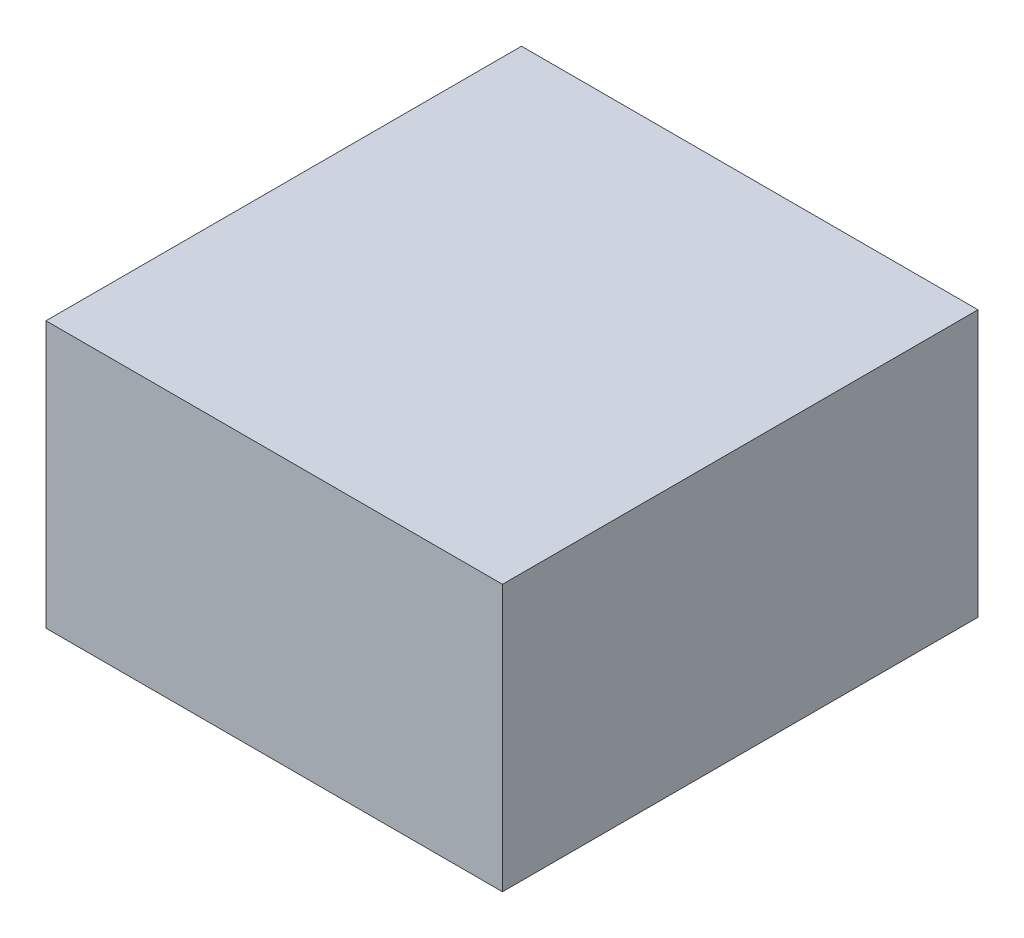
ISO-10303-21;
HEADER;
FILE_DESCRIPTION(('STEP AP214'),'2;1');
FILE_NAME('part.step','',(''),(''),'','','');
FILE_SCHEMA(('AUTOMOTIVE_DESIGN { 1 0 10303 214 1 1 1 1 }'));
ENDSEC;
DATA;
#1=APPLICATION_CONTEXT('core data for automotive mechanical design processes');
#2=APPLICATION_PROTOCOL_DEFINITION('international standard','automotive_design',2000,#1);
#3=PRODUCT_CONTEXT('',#1,'mechanical');
#4=PRODUCT('Part','Part','',(#3));
#5=PRODUCT_RELATED_PRODUCT_CATEGORY('part','',(#4));
#6=PRODUCT_DEFINITION_FORMATION('','',#4);
#7=PRODUCT_DEFINITION_CONTEXT('part definition',#1,'design');
#8=PRODUCT_DEFINITION('design','',#6,#7);
#9=PRODUCT_DEFINITION_SHAPE('','',#8);
#10=(LENGTH_UNIT() NAMED_UNIT(*) SI_UNIT(.MILLI.,.METRE.));
#11=(NAMED_UNIT(*) PLANE_ANGLE_UNIT() SI_UNIT($,.RADIAN.));
#12=(NAMED_UNIT(*) SI_UNIT($,.STERADIAN.) SOLID_ANGLE_UNIT());
#13=UNCERTAINTY_MEASURE_WITH_UNIT(LENGTH_MEASURE(1.E-05),#10,'distance_accuracy_value','');
#14=(GEOMETRIC_REPRESENTATION_CONTEXT(3) GLOBAL_UNCERTAINTY_ASSIGNED_CONTEXT((#13)) GLOBAL_UNIT_ASSIGNED_CONTEXT((#10,
#11,#12)) REPRESENTATION_CONTEXT('',''));
#15=CARTESIAN_POINT('',(0.,0.,0.));
#16=DIRECTION('',(0.,0.,1.));
#17=DIRECTION('',(1.,0.,0.));
#18=AXIS2_PLACEMENT_3D('',#15,#16,#17);
#19=CARTESIAN_POINT('',(24.,14.,50.));
#20=DIRECTION('',(-1.,0.,0.));
#21=DIRECTION('',(0.,-1.,0.));
#22=AXIS2_PLACEMENT_3D('',#19,#20,#21);
#23=PLANE('',#22);
#24=DIRECTION('',(0.,1.,0.));
#25=VECTOR('',#24,1.);
#26=CARTESIAN_POINT('',(24.,14.,0.));
#27=LINE('',#26,#25);
#28=CARTESIAN_POINT('',(24.,-14.,0.));
#29=VERTEX_POINT('',#28);
#30=CARTESIAN_POINT('',(24.,14.,0.));
#31=VERTEX_POINT('',#30);
#32=EDGE_CURVE('E98',#29,#31,#27,.T.);
#33=ORIENTED_EDGE('',*,*,#32,.T.);
#34=DIRECTION('',(0.,0.,-1.));
#35=VECTOR('',#34,1.);
#36=CARTESIAN_POINT('',(24.,14.,50.));
#37=LINE('',#36,#35);
#38=CARTESIAN_POINT('',(24.,14.,50.));
#39=VERTEX_POINT('',#38);
#40=EDGE_CURVE('E11',#39,#31,#37,.T.);
#41=ORIENTED_EDGE('',*,*,#40,.F.);
#42=DIRECTION('',(0.,1.,0.));
#43=VECTOR('',#42,1.);
#44=CARTESIAN_POINT('',(24.,14.,50.));
#45=LINE('',#44,#43);
#46=CARTESIAN_POINT('',(24.,-14.,50.));
#47=VERTEX_POINT('',#46);
#48=EDGE_CURVE('E86',#47,#39,#45,.T.);
#49=ORIENTED_EDGE('',*,*,#48,.F.);
#50=DIRECTION('',(0.,0.,-1.));
#51=VECTOR('',#50,1.);
#52=CARTESIAN_POINT('',(24.,-14.,50.));
#53=LINE('',#52,#51);
#54=EDGE_CURVE('E94',#47,#29,#53,.T.);
#55=ORIENTED_EDGE('',*,*,#54,.T.);
#56=EDGE_LOOP('',(#33,#41,#49,#55));
#57=FACE_BOUND('',#56,.T.);
#58=ADVANCED_FACE('F35',(#57),#23,.F.);
#59=CARTESIAN_POINT('',(-24.,14.,50.));
#60=DIRECTION('',(0.,-1.,0.));
#61=DIRECTION('',(0.,0.,-1.));
#62=AXIS2_PLACEMENT_3D('',#59,#60,#61);
#63=PLANE('',#62);
#64=DIRECTION('',(-1.,0.,0.));
#65=VECTOR('',#64,1.);
#66=CARTESIAN_POINT('',(-24.,14.,0.));
#67=LINE('',#66,#65);
#68=CARTESIAN_POINT('',(-24.,14.,0.));
#69=VERTEX_POINT('',#68);
#70=EDGE_CURVE('E90',#31,#69,#67,.T.);
#71=ORIENTED_EDGE('',*,*,#70,.T.);
#72=DIRECTION('',(0.,0.,-1.));
#73=VECTOR('',#72,1.);
#74=CARTESIAN_POINT('',(-24.,14.,50.));
#75=LINE('',#74,#73);
#76=CARTESIAN_POINT('',(-24.,14.,50.));
#77=VERTEX_POINT('',#76);
#78=EDGE_CURVE('E43',#77,#69,#75,.T.);
#79=ORIENTED_EDGE('',*,*,#78,.F.);
#80=DIRECTION('',(-1.,0.,0.));
#81=VECTOR('',#80,1.);
#82=CARTESIAN_POINT('',(-24.,14.,50.));
#83=LINE('',#82,#81);
#84=EDGE_CURVE('E81',#39,#77,#83,.T.);
#85=ORIENTED_EDGE('',*,*,#84,.F.);
#86=ORIENTED_EDGE('',*,*,#40,.T.);
#87=EDGE_LOOP('',(#71,#79,#85,#86));
#88=FACE_BOUND('',#87,.T.);
#89=ADVANCED_FACE('F89',(#88),#63,.F.);
#90=CARTESIAN_POINT('',(-24.,14.,50.));
#91=DIRECTION('',(1.,0.,0.));
#92=DIRECTION('',(0.,1.,0.));
#93=AXIS2_PLACEMENT_3D('',#90,#91,#92);
#94=PLANE('',#93);
#95=DIRECTION('',(0.,-1.,0.));
#96=VECTOR('',#95,1.);
#97=CARTESIAN_POINT('',(-24.,14.,0.));
#98=LINE('',#97,#96);
#99=CARTESIAN_POINT('',(-24.,-14.,0.));
#100=VERTEX_POINT('',#99);
#101=EDGE_CURVE('E68',#69,#100,#98,.T.);
#102=ORIENTED_EDGE('',*,*,#101,.T.);
#103=DIRECTION('',(0.,0.,-1.));
#104=VECTOR('',#103,1.);
#105=CARTESIAN_POINT('',(-24.,-14.,50.));
#106=LINE('',#105,#104);
#107=CARTESIAN_POINT('',(-24.,-14.,50.));
#108=VERTEX_POINT('',#107);
#109=EDGE_CURVE('E91',#108,#100,#106,.T.);
#110=ORIENTED_EDGE('',*,*,#109,.F.);
#111=DIRECTION('',(0.,-1.,0.));
#112=VECTOR('',#111,1.);
#113=CARTESIAN_POINT('',(-24.,14.,50.));
#114=LINE('',#113,#112);
#115=EDGE_CURVE('E84',#77,#108,#114,.T.);
#116=ORIENTED_EDGE('',*,*,#115,.F.);
#117=ORIENTED_EDGE('',*,*,#78,.T.);
#118=EDGE_LOOP('',(#102,#110,#116,#117));
#119=FACE_BOUND('',#118,.T.);
#120=ADVANCED_FACE('F92',(#119),#94,.F.);
#121=CARTESIAN_POINT('',(-24.,-14.,50.));
#122=DIRECTION('',(0.,1.,0.));
#123=DIRECTION('',(0.,0.,1.));
#124=AXIS2_PLACEMENT_3D('',#121,#122,#123);
#125=PLANE('',#124);
#126=DIRECTION('',(1.,0.,0.));
#127=VECTOR('',#126,1.);
#128=CARTESIAN_POINT('',(-24.,-14.,0.));
#129=LINE('',#128,#127);
#130=EDGE_CURVE('E74',#100,#29,#129,.T.);
#131=ORIENTED_EDGE('',*,*,#130,.T.);
#132=ORIENTED_EDGE('',*,*,#54,.F.);
#133=DIRECTION('',(1.,0.,0.));
#134=VECTOR('',#133,1.);
#135=CARTESIAN_POINT('',(-24.,-14.,50.));
#136=LINE('',#135,#134);
#137=EDGE_CURVE('E51',#108,#47,#136,.T.);
#138=ORIENTED_EDGE('',*,*,#137,.F.);
#139=ORIENTED_EDGE('',*,*,#109,.T.);
#140=EDGE_LOOP('',(#131,#132,#138,#139));
#141=FACE_BOUND('',#140,.T.);
#142=ADVANCED_FACE('F106',(#141),#125,.F.);
#143=CARTESIAN_POINT('',(0.,0.,50.));
#144=DIRECTION('',(0.,0.,1.));
#145=DIRECTION('',(1.,0.,0.));
#146=AXIS2_PLACEMENT_3D('',#143,#144,#145);
#147=PLANE('',#146);
#148=ORIENTED_EDGE('',*,*,#48,.T.);
#149=ORIENTED_EDGE('',*,*,#84,.T.);
#150=ORIENTED_EDGE('',*,*,#115,.T.);
#151=ORIENTED_EDGE('',*,*,#137,.T.);
#152=EDGE_LOOP('',(#148,#149,#150,#151));
#153=FACE_BOUND('',#152,.T.);
#154=ADVANCED_FACE('F82',(#153),#147,.T.);
#155=CARTESIAN_POINT('',(0.,0.,0.));
#156=DIRECTION('',(0.,0.,1.));
#157=DIRECTION('',(1.,0.,0.));
#158=AXIS2_PLACEMENT_3D('',#155,#156,#157);
#159=PLANE('',#158);
#160=CARTESIAN_POINT('',(0.,0.,0.));
#161=DIRECTION('',(0.,0.,1.));
#162=DIRECTION('',(1.,0.,0.));
#163=AXIS2_PLACEMENT_3D('',#160,#161,#162);
#164=CIRCLE('',#163,5.);
#165=CARTESIAN_POINT('',(5.,0.,0.));
#166=VERTEX_POINT('',#165);
#167=EDGE_CURVE('E112',#166,#166,#164,.T.);
#168=ORIENTED_EDGE('',*,*,#167,.T.);
#169=EDGE_LOOP('',(#168));
#170=FACE_BOUND('',#169,.T.);
#171=ORIENTED_EDGE('',*,*,#32,.F.);
#172=ORIENTED_EDGE('',*,*,#130,.F.);
#173=ORIENTED_EDGE('',*,*,#101,.F.);
#174=ORIENTED_EDGE('',*,*,#70,.F.);
#175=EDGE_LOOP('',(#171,#172,#173,#174));
#176=FACE_BOUND('',#175,.T.);
#177=ADVANCED_FACE('F109',(#170,#176),#159,.F.);
#178=CARTESIAN_POINT('',(0.,0.,10.));
#179=DIRECTION('',(0.,0.,-1.));
#180=DIRECTION('',(-1.,0.,0.));
#181=AXIS2_PLACEMENT_3D('',#178,#179,#180);
#182=CYLINDRICAL_SURFACE('',#181,5.);
#183=CARTESIAN_POINT('',(0.,0.,10.));
#184=DIRECTION('',(0.,0.,1.));
#185=DIRECTION('',(1.,0.,0.));
#186=AXIS2_PLACEMENT_3D('',#183,#184,#185);
#187=CIRCLE('',#186,5.);
#188=CARTESIAN_POINT('',(5.,0.,10.));
#189=VERTEX_POINT('',#188);
#190=EDGE_CURVE('E101',#189,#189,#187,.T.);
#191=ORIENTED_EDGE('',*,*,#190,.T.);
#192=EDGE_LOOP('',(#191));
#193=FACE_BOUND('',#192,.T.);
#194=ORIENTED_EDGE('',*,*,#167,.F.);
#195=EDGE_LOOP('',(#194));
#196=FACE_BOUND('',#195,.T.);
#197=ADVANCED_FACE('F118',(#193,#196),#182,.F.);
#198=CARTESIAN_POINT('',(0.,0.,10.));
#199=DIRECTION('',(0.,0.,1.));
#200=DIRECTION('',(1.,0.,0.));
#201=AXIS2_PLACEMENT_3D('',#198,#199,#200);
#202=PLANE('',#201);
#203=ORIENTED_EDGE('',*,*,#190,.F.);
#204=EDGE_LOOP('',(#203));
#205=FACE_BOUND('',#204,.T.);
#206=ADVANCED_FACE('F121',(#205),#202,.F.);
#207=CLOSED_SHELL('',(#58,#89,#120,#142,#154,#177,#197,#206));
#208=MANIFOLD_SOLID_BREP('B2',#207);
#209=ADVANCED_BREP_SHAPE_REPRESENTATION('',(#18,#208),#14);
#210=SHAPE_DEFINITION_REPRESENTATION(#9,#209);
ENDSEC;
END-ISO-10303-21;
